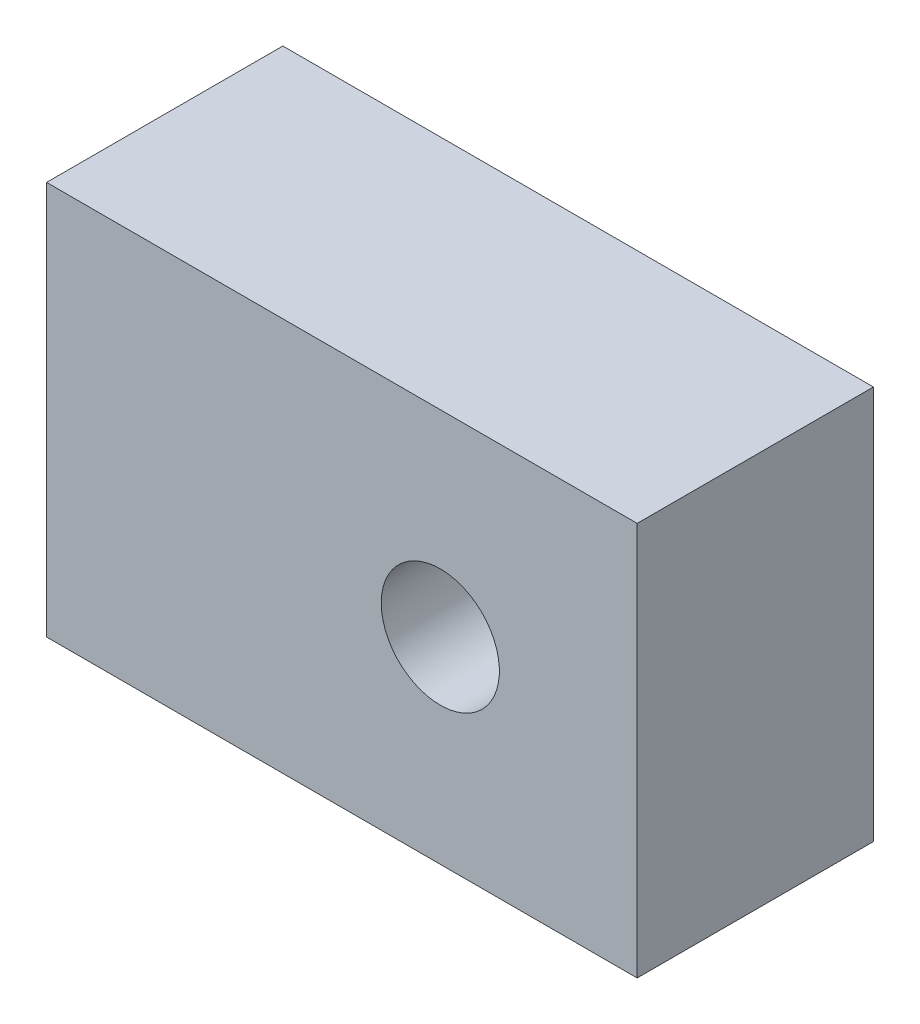
ISO-10303-21;
HEADER;
FILE_DESCRIPTION(('STEP AP214'),'2;1');
FILE_NAME('part.step','',(''),(''),'','','');
FILE_SCHEMA(('AUTOMOTIVE_DESIGN { 1 0 10303 214 1 1 1 1 }'));
ENDSEC;
DATA;
#1=APPLICATION_CONTEXT('core data for automotive mechanical design processes');
#2=APPLICATION_PROTOCOL_DEFINITION('international standard','automotive_design',2000,#1);
#3=PRODUCT_CONTEXT('',#1,'mechanical');
#4=PRODUCT('Part','Part','',(#3));
#5=PRODUCT_RELATED_PRODUCT_CATEGORY('part','',(#4));
#6=PRODUCT_DEFINITION_FORMATION('','',#4);
#7=PRODUCT_DEFINITION_CONTEXT('part definition',#1,'design');
#8=PRODUCT_DEFINITION('design','',#6,#7);
#9=PRODUCT_DEFINITION_SHAPE('','',#8);
#10=(LENGTH_UNIT() NAMED_UNIT(*) SI_UNIT(.MILLI.,.METRE.));
#11=(NAMED_UNIT(*) PLANE_ANGLE_UNIT() SI_UNIT($,.RADIAN.));
#12=(NAMED_UNIT(*) SI_UNIT($,.STERADIAN.) SOLID_ANGLE_UNIT());
#13=UNCERTAINTY_MEASURE_WITH_UNIT(LENGTH_MEASURE(1.E-05),#10,'distance_accuracy_value','');
#14=(GEOMETRIC_REPRESENTATION_CONTEXT(3) GLOBAL_UNCERTAINTY_ASSIGNED_CONTEXT((#13)) GLOBAL_UNIT_ASSIGNED_CONTEXT((#10,
#11,#12)) REPRESENTATION_CONTEXT('',''));
#15=CARTESIAN_POINT('',(0.,0.,0.));
#16=DIRECTION('',(0.,0.,1.));
#17=DIRECTION('',(1.,0.,0.));
#18=AXIS2_PLACEMENT_3D('',#15,#16,#17);
#19=CARTESIAN_POINT('',(0.,0.,-6.));
#20=DIRECTION('',(1.,0.,0.));
#21=DIRECTION('',(0.,0.,1.));
#22=AXIS2_PLACEMENT_3D('',#19,#20,#21);
#23=PLANE('',#22);
#24=DIRECTION('',(0.,-1.,0.));
#25=VECTOR('',#24,1.);
#26=CARTESIAN_POINT('',(0.,0.,0.));
#27=LINE('',#26,#25);
#28=CARTESIAN_POINT('',(0.,10.,0.));
#29=VERTEX_POINT('',#28);
#30=CARTESIAN_POINT('',(0.,0.,0.));
#31=VERTEX_POINT('',#30);
#32=EDGE_CURVE('E101',#29,#31,#27,.T.);
#33=ORIENTED_EDGE('',*,*,#32,.F.);
#34=DIRECTION('',(0.,0.,1.));
#35=VECTOR('',#34,1.);
#36=CARTESIAN_POINT('',(0.,10.,-6.));
#37=LINE('',#36,#35);
#38=CARTESIAN_POINT('',(0.,10.,-6.));
#39=VERTEX_POINT('',#38);
#40=EDGE_CURVE('E100',#39,#29,#37,.T.);
#41=ORIENTED_EDGE('',*,*,#40,.F.);
#42=DIRECTION('',(0.,-1.,0.));
#43=VECTOR('',#42,1.);
#44=CARTESIAN_POINT('',(0.,0.,-6.));
#45=LINE('',#44,#43);
#46=CARTESIAN_POINT('',(0.,0.,-6.));
#47=VERTEX_POINT('',#46);
#48=EDGE_CURVE('E94',#39,#47,#45,.T.);
#49=ORIENTED_EDGE('',*,*,#48,.T.);
#50=DIRECTION('',(0.,0.,1.));
#51=VECTOR('',#50,1.);
#52=CARTESIAN_POINT('',(0.,0.,-6.));
#53=LINE('',#52,#51);
#54=EDGE_CURVE('E11',#47,#31,#53,.T.);
#55=ORIENTED_EDGE('',*,*,#54,.T.);
#56=EDGE_LOOP('',(#33,#41,#49,#55));
#57=FACE_BOUND('',#56,.T.);
#58=ADVANCED_FACE('F37',(#57),#23,.F.);
#59=CARTESIAN_POINT('',(0.,0.,-6.));
#60=DIRECTION('',(0.,1.,0.));
#61=DIRECTION('',(0.,0.,-1.));
#62=AXIS2_PLACEMENT_3D('',#59,#60,#61);
#63=PLANE('',#62);
#64=DIRECTION('',(1.,0.,0.));
#65=VECTOR('',#64,1.);
#66=CARTESIAN_POINT('',(0.,0.,0.));
#67=LINE('',#66,#65);
#68=CARTESIAN_POINT('',(15.,0.,0.));
#69=VERTEX_POINT('',#68);
#70=EDGE_CURVE('E103',#31,#69,#67,.T.);
#71=ORIENTED_EDGE('',*,*,#70,.F.);
#72=ORIENTED_EDGE('',*,*,#54,.F.);
#73=DIRECTION('',(1.,0.,0.));
#74=VECTOR('',#73,1.);
#75=CARTESIAN_POINT('',(0.,0.,-6.));
#76=LINE('',#75,#74);
#77=CARTESIAN_POINT('',(15.,0.,-6.));
#78=VERTEX_POINT('',#77);
#79=EDGE_CURVE('E78',#47,#78,#76,.T.);
#80=ORIENTED_EDGE('',*,*,#79,.T.);
#81=DIRECTION('',(0.,0.,1.));
#82=VECTOR('',#81,1.);
#83=CARTESIAN_POINT('',(15.,0.,-6.));
#84=LINE('',#83,#82);
#85=EDGE_CURVE('E45',#78,#69,#84,.T.);
#86=ORIENTED_EDGE('',*,*,#85,.T.);
#87=EDGE_LOOP('',(#71,#72,#80,#86));
#88=FACE_BOUND('',#87,.T.);
#89=ADVANCED_FACE('F92',(#88),#63,.F.);
#90=CARTESIAN_POINT('',(15.,0.,-6.));
#91=DIRECTION('',(-1.,0.,0.));
#92=DIRECTION('',(0.,0.,-1.));
#93=AXIS2_PLACEMENT_3D('',#90,#91,#92);
#94=PLANE('',#93);
#95=DIRECTION('',(0.,1.,0.));
#96=VECTOR('',#95,1.);
#97=CARTESIAN_POINT('',(15.,0.,0.));
#98=LINE('',#97,#96);
#99=CARTESIAN_POINT('',(15.,10.,0.));
#100=VERTEX_POINT('',#99);
#101=EDGE_CURVE('E88',#69,#100,#98,.T.);
#102=ORIENTED_EDGE('',*,*,#101,.F.);
#103=ORIENTED_EDGE('',*,*,#85,.F.);
#104=DIRECTION('',(0.,1.,0.));
#105=VECTOR('',#104,1.);
#106=CARTESIAN_POINT('',(15.,0.,-6.));
#107=LINE('',#106,#105);
#108=CARTESIAN_POINT('',(15.,10.,-6.));
#109=VERTEX_POINT('',#108);
#110=EDGE_CURVE('E81',#78,#109,#107,.T.);
#111=ORIENTED_EDGE('',*,*,#110,.T.);
#112=DIRECTION('',(0.,0.,1.));
#113=VECTOR('',#112,1.);
#114=CARTESIAN_POINT('',(15.,10.,-6.));
#115=LINE('',#114,#113);
#116=EDGE_CURVE('E91',#109,#100,#115,.T.);
#117=ORIENTED_EDGE('',*,*,#116,.T.);
#118=EDGE_LOOP('',(#102,#103,#111,#117));
#119=FACE_BOUND('',#118,.T.);
#120=ADVANCED_FACE('F87',(#119),#94,.F.);
#121=CARTESIAN_POINT('',(0.,10.,-6.));
#122=DIRECTION('',(0.,-1.,0.));
#123=DIRECTION('',(0.,0.,1.));
#124=AXIS2_PLACEMENT_3D('',#121,#122,#123);
#125=PLANE('',#124);
#126=DIRECTION('',(-1.,0.,0.));
#127=VECTOR('',#126,1.);
#128=CARTESIAN_POINT('',(0.,10.,0.));
#129=LINE('',#128,#127);
#130=EDGE_CURVE('E67',#100,#29,#129,.T.);
#131=ORIENTED_EDGE('',*,*,#130,.F.);
#132=ORIENTED_EDGE('',*,*,#116,.F.);
#133=DIRECTION('',(-1.,0.,0.));
#134=VECTOR('',#133,1.);
#135=CARTESIAN_POINT('',(0.,10.,-6.));
#136=LINE('',#135,#134);
#137=EDGE_CURVE('E53',#109,#39,#136,.T.);
#138=ORIENTED_EDGE('',*,*,#137,.T.);
#139=ORIENTED_EDGE('',*,*,#40,.T.);
#140=EDGE_LOOP('',(#131,#132,#138,#139));
#141=FACE_BOUND('',#140,.T.);
#142=ADVANCED_FACE('F113',(#141),#125,.F.);
#143=CARTESIAN_POINT('',(0.,0.,-6.));
#144=DIRECTION('',(0.,0.,1.));
#145=DIRECTION('',(-1.,0.,0.));
#146=AXIS2_PLACEMENT_3D('',#143,#144,#145);
#147=PLANE('',#146);
#148=CARTESIAN_POINT('',(10.,5.,-6.));
#149=DIRECTION('',(0.,0.,-1.));
#150=DIRECTION('',(-1.,0.,0.));
#151=AXIS2_PLACEMENT_3D('',#148,#149,#150);
#152=CIRCLE('',#151,1.5);
#153=CARTESIAN_POINT('',(8.5,5.,-6.));
#154=VERTEX_POINT('',#153);
#155=EDGE_CURVE('E104',#154,#154,#152,.T.);
#156=ORIENTED_EDGE('',*,*,#155,.F.);
#157=EDGE_LOOP('',(#156));
#158=FACE_BOUND('',#157,.T.);
#159=ORIENTED_EDGE('',*,*,#48,.F.);
#160=ORIENTED_EDGE('',*,*,#137,.F.);
#161=ORIENTED_EDGE('',*,*,#110,.F.);
#162=ORIENTED_EDGE('',*,*,#79,.F.);
#163=EDGE_LOOP('',(#159,#160,#161,#162));
#164=FACE_BOUND('',#163,.T.);
#165=ADVANCED_FACE('F83',(#158,#164),#147,.F.);
#166=CARTESIAN_POINT('',(0.,0.,0.));
#167=DIRECTION('',(0.,0.,1.));
#168=DIRECTION('',(-1.,0.,0.));
#169=AXIS2_PLACEMENT_3D('',#166,#167,#168);
#170=PLANE('',#169);
#171=CARTESIAN_POINT('',(10.,5.,0.));
#172=DIRECTION('',(0.,0.,-1.));
#173=DIRECTION('',(-1.,0.,0.));
#174=AXIS2_PLACEMENT_3D('',#171,#172,#173);
#175=CIRCLE('',#174,1.5);
#176=CARTESIAN_POINT('',(8.5,5.,0.));
#177=VERTEX_POINT('',#176);
#178=EDGE_CURVE('E171',#177,#177,#175,.T.);
#179=ORIENTED_EDGE('',*,*,#178,.T.);
#180=EDGE_LOOP('',(#179));
#181=FACE_BOUND('',#180,.T.);
#182=ORIENTED_EDGE('',*,*,#32,.T.);
#183=ORIENTED_EDGE('',*,*,#70,.T.);
#184=ORIENTED_EDGE('',*,*,#101,.T.);
#185=ORIENTED_EDGE('',*,*,#130,.T.);
#186=EDGE_LOOP('',(#182,#183,#184,#185));
#187=FACE_BOUND('',#186,.T.);
#188=ADVANCED_FACE('F109',(#181,#187),#170,.T.);
#189=CARTESIAN_POINT('',(10.,5.,-6.));
#190=DIRECTION('',(0.,0.,1.));
#191=DIRECTION('',(-1.,0.,0.));
#192=AXIS2_PLACEMENT_3D('',#189,#190,#191);
#193=CYLINDRICAL_SURFACE('',#192,1.5);
#194=ORIENTED_EDGE('',*,*,#155,.T.);
#195=EDGE_LOOP('',(#194));
#196=FACE_BOUND('',#195,.T.);
#197=ORIENTED_EDGE('',*,*,#178,.F.);
#198=EDGE_LOOP('',(#197));
#199=FACE_BOUND('',#198,.T.);
#200=ADVANCED_FACE('F153',(#196,#199),#193,.F.);
#201=CLOSED_SHELL('',(#58,#89,#120,#142,#165,#188,#200));
#202=MANIFOLD_SOLID_BREP('B2',#201);
#203=ADVANCED_BREP_SHAPE_REPRESENTATION('',(#18,#202),#14);
#204=SHAPE_DEFINITION_REPRESENTATION(#9,#203);
ENDSEC;
END-ISO-10303-21;
